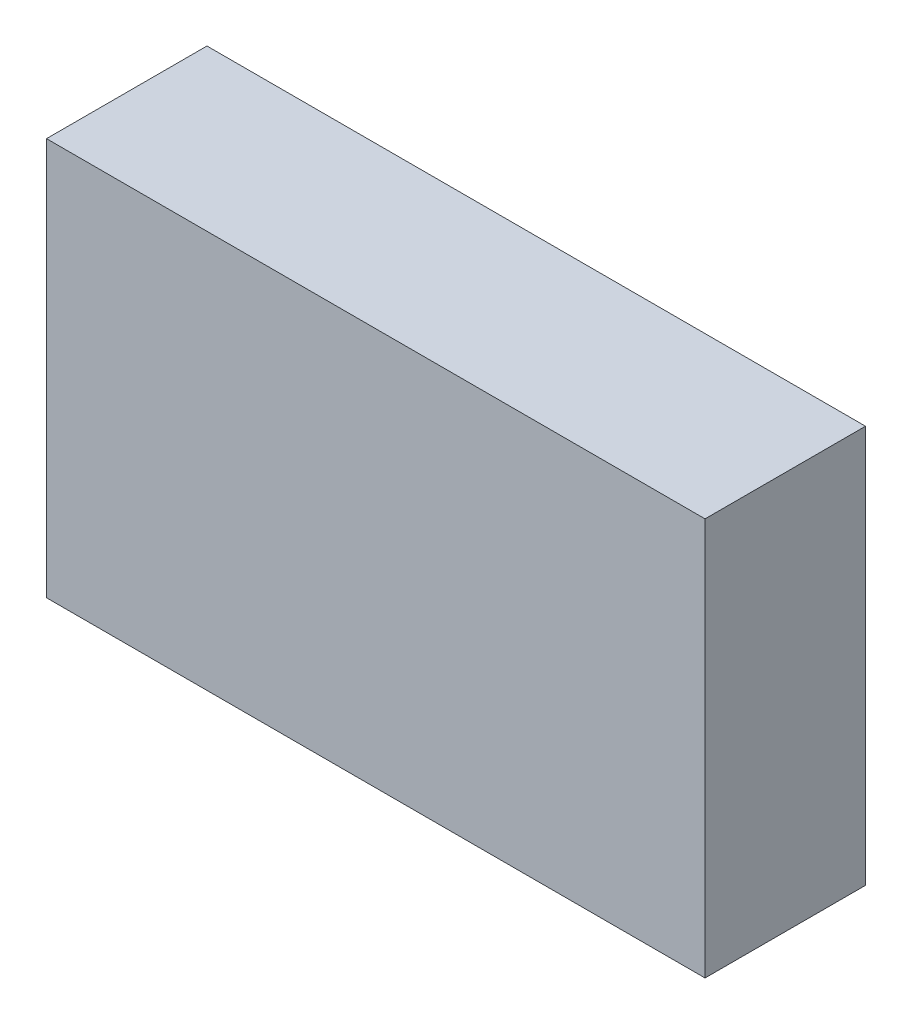
ISO-10303-21;
HEADER;
FILE_DESCRIPTION(('STEP AP214'),'2;1');
FILE_NAME('part.step','',(''),(''),'','','');
FILE_SCHEMA(('AUTOMOTIVE_DESIGN { 1 0 10303 214 1 1 1 1 }'));
ENDSEC;
DATA;
#1=APPLICATION_CONTEXT('core data for automotive mechanical design processes');
#2=APPLICATION_PROTOCOL_DEFINITION('international standard','automotive_design',2000,#1);
#3=PRODUCT_CONTEXT('',#1,'mechanical');
#4=PRODUCT('Part','Part','',(#3));
#5=PRODUCT_RELATED_PRODUCT_CATEGORY('part','',(#4));
#6=PRODUCT_DEFINITION_FORMATION('','',#4);
#7=PRODUCT_DEFINITION_CONTEXT('part definition',#1,'design');
#8=PRODUCT_DEFINITION('design','',#6,#7);
#9=PRODUCT_DEFINITION_SHAPE('','',#8);
#10=(LENGTH_UNIT() NAMED_UNIT(*) SI_UNIT(.MILLI.,.METRE.));
#11=(NAMED_UNIT(*) PLANE_ANGLE_UNIT() SI_UNIT($,.RADIAN.));
#12=(NAMED_UNIT(*) SI_UNIT($,.STERADIAN.) SOLID_ANGLE_UNIT());
#13=UNCERTAINTY_MEASURE_WITH_UNIT(LENGTH_MEASURE(1.E-05),#10,'distance_accuracy_value','');
#14=(GEOMETRIC_REPRESENTATION_CONTEXT(3) GLOBAL_UNCERTAINTY_ASSIGNED_CONTEXT((#13)) GLOBAL_UNIT_ASSIGNED_CONTEXT((#10,
#11,#12)) REPRESENTATION_CONTEXT('',''));
#15=CARTESIAN_POINT('',(0.,0.,0.));
#16=DIRECTION('',(0.,0.,1.));
#17=DIRECTION('',(1.,0.,0.));
#18=AXIS2_PLACEMENT_3D('',#15,#16,#17);
#19=CARTESIAN_POINT('',(3.14682612178813,1.,-11.4121351460675));
#20=DIRECTION('',(1.,0.,0.));
#21=DIRECTION('',(0.,0.,-1.));
#22=AXIS2_PLACEMENT_3D('',#19,#20,#21);
#23=PLANE('',#22);
#24=DIRECTION('',(0.,0.,1.));
#25=VECTOR('',#24,1.);
#26=CARTESIAN_POINT('',(3.14682612178813,0.,-11.4121351460675));
#27=LINE('',#26,#25);
#28=CARTESIAN_POINT('',(3.14682612178813,0.,-11.4121351460675));
#29=VERTEX_POINT('',#28);
#30=CARTESIAN_POINT('',(3.14682612178813,0.,-11.0086117885288));
#31=VERTEX_POINT('',#30);
#32=EDGE_CURVE('E11',#29,#31,#27,.T.);
#33=ORIENTED_EDGE('',*,*,#32,.T.);
#34=DIRECTION('',(0.,-1.,0.));
#35=VECTOR('',#34,1.);
#36=CARTESIAN_POINT('',(3.14682612178813,1.,-11.0086117885288));
#37=LINE('',#36,#35);
#38=CARTESIAN_POINT('',(3.14682612178813,1.,-11.0086117885288));
#39=VERTEX_POINT('',#38);
#40=EDGE_CURVE('E110',#39,#31,#37,.T.);
#41=ORIENTED_EDGE('',*,*,#40,.F.);
#42=DIRECTION('',(0.,0.,1.));
#43=VECTOR('',#42,1.);
#44=CARTESIAN_POINT('',(3.14682612178813,1.,-11.4121351460675));
#45=LINE('',#44,#43);
#46=CARTESIAN_POINT('',(3.14682612178813,1.,-11.4121351460675));
#47=VERTEX_POINT('',#46);
#48=EDGE_CURVE('E43',#47,#39,#45,.T.);
#49=ORIENTED_EDGE('',*,*,#48,.F.);
#50=DIRECTION('',(0.,-1.,0.));
#51=VECTOR('',#50,1.);
#52=CARTESIAN_POINT('',(3.14682612178813,1.,-11.4121351460675));
#53=LINE('',#52,#51);
#54=EDGE_CURVE('E83',#47,#29,#53,.T.);
#55=ORIENTED_EDGE('',*,*,#54,.T.);
#56=EDGE_LOOP('',(#33,#41,#49,#55));
#57=FACE_BOUND('',#56,.T.);
#58=ADVANCED_FACE('F39',(#57),#23,.F.);
#59=CARTESIAN_POINT('',(3.14682612178813,1.,-11.0086117885288));
#60=DIRECTION('',(0.,0.,-1.));
#61=DIRECTION('',(-1.,0.,0.));
#62=AXIS2_PLACEMENT_3D('',#59,#60,#61);
#63=PLANE('',#62);
#64=DIRECTION('',(1.,0.,0.));
#65=VECTOR('',#64,1.);
#66=CARTESIAN_POINT('',(3.14682612178813,0.,-11.0086117885288));
#67=LINE('',#66,#65);
#68=CARTESIAN_POINT('',(4.80295323501973,0.,-11.0086117885288));
#69=VERTEX_POINT('',#68);
#70=EDGE_CURVE('E49',#31,#69,#67,.T.);
#71=ORIENTED_EDGE('',*,*,#70,.T.);
#72=DIRECTION('',(0.,-1.,0.));
#73=VECTOR('',#72,1.);
#74=CARTESIAN_POINT('',(4.80295323501973,1.,-11.0086117885288));
#75=LINE('',#74,#73);
#76=CARTESIAN_POINT('',(4.80295323501973,1.,-11.0086117885288));
#77=VERTEX_POINT('',#76);
#78=EDGE_CURVE('E97',#77,#69,#75,.T.);
#79=ORIENTED_EDGE('',*,*,#78,.F.);
#80=DIRECTION('',(1.,0.,0.));
#81=VECTOR('',#80,1.);
#82=CARTESIAN_POINT('',(3.14682612178813,1.,-11.0086117885288));
#83=LINE('',#82,#81);
#84=EDGE_CURVE('E75',#39,#77,#83,.T.);
#85=ORIENTED_EDGE('',*,*,#84,.F.);
#86=ORIENTED_EDGE('',*,*,#40,.T.);
#87=EDGE_LOOP('',(#71,#79,#85,#86));
#88=FACE_BOUND('',#87,.T.);
#89=ADVANCED_FACE('F113',(#88),#63,.F.);
#90=CARTESIAN_POINT('',(4.80295323501973,1.,-11.4121351460675));
#91=DIRECTION('',(1.,0.,0.));
#92=DIRECTION('',(0.,0.,-1.));
#93=AXIS2_PLACEMENT_3D('',#90,#91,#92);
#94=PLANE('',#93);
#95=DIRECTION('',(0.,0.,1.));
#96=VECTOR('',#95,1.);
#97=CARTESIAN_POINT('',(4.80295323501973,0.,-11.4121351460675));
#98=LINE('',#97,#96);
#99=CARTESIAN_POINT('',(4.80295323501973,0.,-11.4121351460675));
#100=VERTEX_POINT('',#99);
#101=EDGE_CURVE('E99',#100,#69,#98,.T.);
#102=ORIENTED_EDGE('',*,*,#101,.F.);
#103=DIRECTION('',(0.,-1.,0.));
#104=VECTOR('',#103,1.);
#105=CARTESIAN_POINT('',(4.80295323501973,1.,-11.4121351460675));
#106=LINE('',#105,#104);
#107=CARTESIAN_POINT('',(4.80295323501973,1.,-11.4121351460675));
#108=VERTEX_POINT('',#107);
#109=EDGE_CURVE('E88',#108,#100,#106,.T.);
#110=ORIENTED_EDGE('',*,*,#109,.F.);
#111=DIRECTION('',(0.,0.,1.));
#112=VECTOR('',#111,1.);
#113=CARTESIAN_POINT('',(4.80295323501973,1.,-11.4121351460675));
#114=LINE('',#113,#112);
#115=EDGE_CURVE('E108',#108,#77,#114,.T.);
#116=ORIENTED_EDGE('',*,*,#115,.T.);
#117=ORIENTED_EDGE('',*,*,#78,.T.);
#118=EDGE_LOOP('',(#102,#110,#116,#117));
#119=FACE_BOUND('',#118,.T.);
#120=ADVANCED_FACE('F100',(#119),#94,.T.);
#121=CARTESIAN_POINT('',(3.14682612178813,1.,-11.4121351460675));
#122=DIRECTION('',(0.,0.,-1.));
#123=DIRECTION('',(-1.,0.,0.));
#124=AXIS2_PLACEMENT_3D('',#121,#122,#123);
#125=PLANE('',#124);
#126=DIRECTION('',(1.,0.,0.));
#127=VECTOR('',#126,1.);
#128=CARTESIAN_POINT('',(3.14682612178813,0.,-11.4121351460675));
#129=LINE('',#128,#127);
#130=EDGE_CURVE('E92',#29,#100,#129,.T.);
#131=ORIENTED_EDGE('',*,*,#130,.F.);
#132=ORIENTED_EDGE('',*,*,#54,.F.);
#133=DIRECTION('',(1.,0.,0.));
#134=VECTOR('',#133,1.);
#135=CARTESIAN_POINT('',(3.14682612178813,1.,-11.4121351460675));
#136=LINE('',#135,#134);
#137=EDGE_CURVE('E94',#47,#108,#136,.T.);
#138=ORIENTED_EDGE('',*,*,#137,.T.);
#139=ORIENTED_EDGE('',*,*,#109,.T.);
#140=EDGE_LOOP('',(#131,#132,#138,#139));
#141=FACE_BOUND('',#140,.T.);
#142=ADVANCED_FACE('F90',(#141),#125,.T.);
#143=CARTESIAN_POINT('',(0.,1.,0.));
#144=DIRECTION('',(0.,1.,0.));
#145=DIRECTION('',(0.,0.,1.));
#146=AXIS2_PLACEMENT_3D('',#143,#144,#145);
#147=PLANE('',#146);
#148=ORIENTED_EDGE('',*,*,#48,.T.);
#149=ORIENTED_EDGE('',*,*,#84,.T.);
#150=ORIENTED_EDGE('',*,*,#115,.F.);
#151=ORIENTED_EDGE('',*,*,#137,.F.);
#152=EDGE_LOOP('',(#148,#149,#150,#151));
#153=FACE_BOUND('',#152,.T.);
#154=ADVANCED_FACE('F41',(#153),#147,.T.);
#155=CARTESIAN_POINT('',(0.,0.,0.));
#156=DIRECTION('',(0.,1.,0.));
#157=DIRECTION('',(0.,0.,1.));
#158=AXIS2_PLACEMENT_3D('',#155,#156,#157);
#159=PLANE('',#158);
#160=ORIENTED_EDGE('',*,*,#32,.F.);
#161=ORIENTED_EDGE('',*,*,#130,.T.);
#162=ORIENTED_EDGE('',*,*,#101,.T.);
#163=ORIENTED_EDGE('',*,*,#70,.F.);
#164=EDGE_LOOP('',(#160,#161,#162,#163));
#165=FACE_BOUND('',#164,.T.);
#166=ADVANCED_FACE('F102',(#165),#159,.F.);
#167=CLOSED_SHELL('',(#58,#89,#120,#142,#154,#166));
#168=MANIFOLD_SOLID_BREP('B2',#167);
#169=ADVANCED_BREP_SHAPE_REPRESENTATION('',(#18,#168),#14);
#170=SHAPE_DEFINITION_REPRESENTATION(#9,#169);
ENDSEC;
END-ISO-10303-21;
